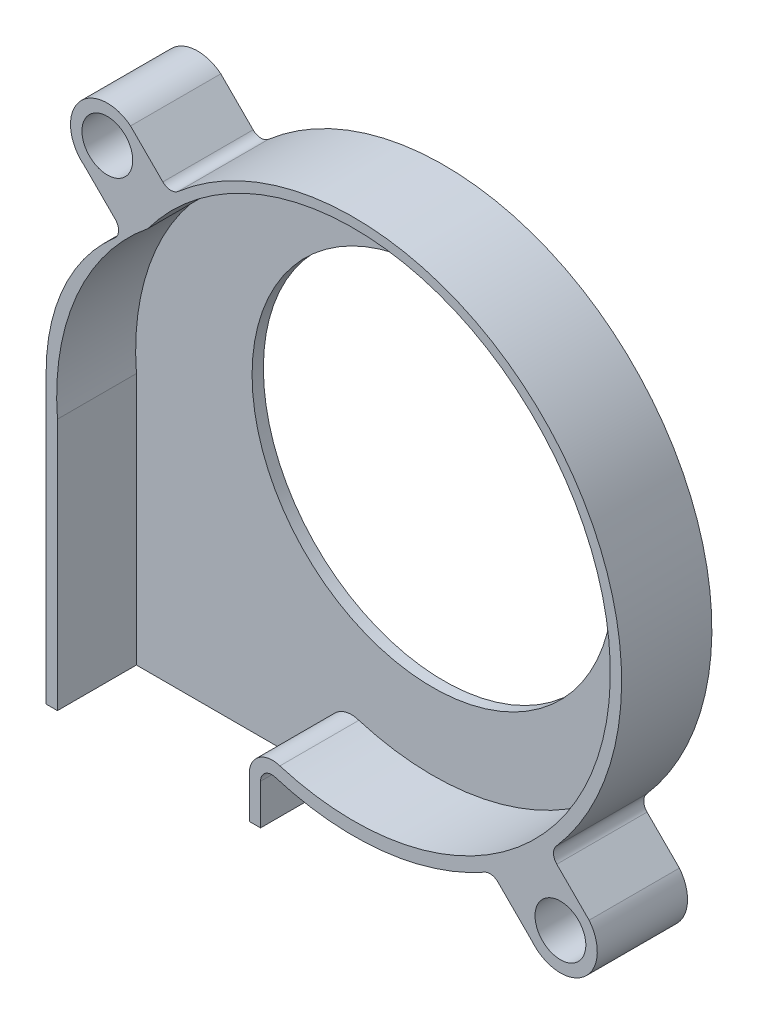
ISO-10303-21;
HEADER;
FILE_DESCRIPTION(('STEP AP214'),'2;1');
FILE_NAME('part.step','',(''),(''),'','','');
FILE_SCHEMA(('AUTOMOTIVE_DESIGN { 1 0 10303 214 1 1 1 1 }'));
ENDSEC;
DATA;
#1=APPLICATION_CONTEXT('core data for automotive mechanical design processes');
#2=APPLICATION_PROTOCOL_DEFINITION('international standard','automotive_design',2000,#1);
#3=PRODUCT_CONTEXT('',#1,'mechanical');
#4=PRODUCT('Part','Part','',(#3));
#5=PRODUCT_RELATED_PRODUCT_CATEGORY('part','',(#4));
#6=PRODUCT_DEFINITION_FORMATION('','',#4);
#7=PRODUCT_DEFINITION_CONTEXT('part definition',#1,'design');
#8=PRODUCT_DEFINITION('design','',#6,#7);
#9=PRODUCT_DEFINITION_SHAPE('','',#8);
#10=(LENGTH_UNIT() NAMED_UNIT(*) SI_UNIT(.MILLI.,.METRE.));
#11=(NAMED_UNIT(*) PLANE_ANGLE_UNIT() SI_UNIT($,.RADIAN.));
#12=(NAMED_UNIT(*) SI_UNIT($,.STERADIAN.) SOLID_ANGLE_UNIT());
#13=UNCERTAINTY_MEASURE_WITH_UNIT(LENGTH_MEASURE(1.E-05),#10,'distance_accuracy_value','');
#14=(GEOMETRIC_REPRESENTATION_CONTEXT(3) GLOBAL_UNCERTAINTY_ASSIGNED_CONTEXT((#13)) GLOBAL_UNIT_ASSIGNED_CONTEXT((#10,
#11,#12)) REPRESENTATION_CONTEXT('',''));
#15=CARTESIAN_POINT('',(0.,0.,0.));
#16=DIRECTION('',(0.,0.,1.));
#17=DIRECTION('',(1.,0.,0.));
#18=AXIS2_PLACEMENT_3D('',#15,#16,#17);
#19=CARTESIAN_POINT('',(5.41805094379559,39.5715414161188,8.));
#20=DIRECTION('',(0.,0.,-1.));
#21=DIRECTION('',(-1.,0.,0.));
#22=AXIS2_PLACEMENT_3D('',#19,#20,#21);
#23=CYLINDRICAL_SURFACE('',#22,1.);
#24=DIRECTION('',(0.,0.,-1.));
#25=VECTOR('',#24,1.);
#26=CARTESIAN_POINT('',(6.07364093376227,38.816424362242,8.));
#27=LINE('',#26,#25);
#28=CARTESIAN_POINT('',(6.07364093376226,38.816424362242,8.));
#29=VERTEX_POINT('',#28);
#30=CARTESIAN_POINT('',(6.07364093376226,38.816424362242,0.));
#31=VERTEX_POINT('',#30);
#32=EDGE_CURVE('E321',#29,#31,#27,.T.);
#33=ORIENTED_EDGE('',*,*,#32,.F.);
#34=CARTESIAN_POINT('',(5.41805094379559,39.5715414161188,8.));
#35=DIRECTION('',(0.,0.,-1.));
#36=DIRECTION('',(-1.,0.,0.));
#37=AXIS2_PLACEMENT_3D('',#34,#35,#36);
#38=CIRCLE('',#37,1.);
#39=CARTESIAN_POINT('',(6.12515772498214,40.2786481973053,8.));
#40=VERTEX_POINT('',#39);
#41=EDGE_CURVE('E327',#29,#40,#38,.F.);
#42=ORIENTED_EDGE('',*,*,#41,.T.);
#43=DIRECTION('',(0.,0.,1.));
#44=VECTOR('',#43,1.);
#45=CARTESIAN_POINT('',(6.12515772498214,40.2786481973053,8.));
#46=LINE('',#45,#44);
#47=CARTESIAN_POINT('',(6.12515772498214,40.2786481973053,0.));
#48=VERTEX_POINT('',#47);
#49=EDGE_CURVE('E324',#48,#40,#46,.T.);
#50=ORIENTED_EDGE('',*,*,#49,.F.);
#51=CARTESIAN_POINT('',(5.41805094379559,39.5715414161188,0.));
#52=DIRECTION('',(0.,0.,-1.));
#53=DIRECTION('',(-1.,0.,0.));
#54=AXIS2_PLACEMENT_3D('',#51,#52,#53);
#55=CIRCLE('',#54,1.);
#56=EDGE_CURVE('E329',#48,#31,#55,.T.);
#57=ORIENTED_EDGE('',*,*,#56,.T.);
#58=EDGE_LOOP('',(#33,#42,#50,#57));
#59=FACE_BOUND('',#58,.T.);
#60=ADVANCED_FACE('F33',(#59),#23,.F.);
#61=CARTESIAN_POINT('',(0.,0.,8.));
#62=DIRECTION('',(1.,0.,0.));
#63=DIRECTION('',(0.,0.,-1.));
#64=AXIS2_PLACEMENT_3D('',#61,#62,#63);
#65=PLANE('',#64);
#66=DIRECTION('',(0.,-1.,0.));
#67=VECTOR('',#66,1.);
#68=CARTESIAN_POINT('',(0.,0.,0.));
#69=LINE('',#68,#67);
#70=CARTESIAN_POINT('',(0.,25.5,0.));
#71=VERTEX_POINT('',#70);
#72=CARTESIAN_POINT('',(0.,0.,0.));
#73=VERTEX_POINT('',#72);
#74=EDGE_CURVE('E234',#71,#73,#69,.T.);
#75=ORIENTED_EDGE('',*,*,#74,.T.);
#76=DIRECTION('',(0.,0.,-1.));
#77=VECTOR('',#76,1.);
#78=CARTESIAN_POINT('',(0.,0.,8.));
#79=LINE('',#78,#77);
#80=CARTESIAN_POINT('',(0.,0.,8.));
#81=VERTEX_POINT('',#80);
#82=EDGE_CURVE('E318',#81,#73,#79,.T.);
#83=ORIENTED_EDGE('',*,*,#82,.F.);
#84=DIRECTION('',(0.,-1.,0.));
#85=VECTOR('',#84,1.);
#86=CARTESIAN_POINT('',(0.,0.,8.));
#87=LINE('',#86,#85);
#88=CARTESIAN_POINT('',(0.,25.5,8.));
#89=VERTEX_POINT('',#88);
#90=EDGE_CURVE('E243',#89,#81,#87,.T.);
#91=ORIENTED_EDGE('',*,*,#90,.F.);
#92=DIRECTION('',(0.,0.,-1.));
#93=VECTOR('',#92,1.);
#94=CARTESIAN_POINT('',(0.,25.5,8.));
#95=LINE('',#94,#93);
#96=EDGE_CURVE('E274',#89,#71,#95,.T.);
#97=ORIENTED_EDGE('',*,*,#96,.T.);
#98=EDGE_LOOP('',(#75,#83,#91,#97));
#99=FACE_BOUND('',#98,.T.);
#100=ADVANCED_FACE('F435',(#99),#65,.F.);
#101=CARTESIAN_POINT('',(0.,0.,8.));
#102=DIRECTION('',(0.,1.,0.));
#103=DIRECTION('',(0.,0.,1.));
#104=AXIS2_PLACEMENT_3D('',#101,#102,#103);
#105=PLANE('',#104);
#106=DIRECTION('',(1.,0.,0.));
#107=VECTOR('',#106,1.);
#108=CARTESIAN_POINT('',(0.,0.,8.));
#109=LINE('',#108,#107);
#110=CARTESIAN_POINT('',(18.,0.,8.));
#111=VERTEX_POINT('',#110);
#112=CARTESIAN_POINT('',(19.,0.,8.));
#113=VERTEX_POINT('',#112);
#114=EDGE_CURVE('E246',#111,#113,#109,.T.);
#115=ORIENTED_EDGE('',*,*,#114,.F.);
#116=DIRECTION('',(0.,0.,1.));
#117=VECTOR('',#116,1.);
#118=CARTESIAN_POINT('',(18.,0.,1.));
#119=LINE('',#118,#117);
#120=CARTESIAN_POINT('',(18.,0.,1.));
#121=VERTEX_POINT('',#120);
#122=EDGE_CURVE('E235',#121,#111,#119,.T.);
#123=ORIENTED_EDGE('',*,*,#122,.F.);
#124=DIRECTION('',(1.,0.,0.));
#125=VECTOR('',#124,1.);
#126=CARTESIAN_POINT('',(18.,0.,1.));
#127=LINE('',#126,#125);
#128=CARTESIAN_POINT('',(1.,0.,1.));
#129=VERTEX_POINT('',#128);
#130=EDGE_CURVE('E222',#129,#121,#127,.T.);
#131=ORIENTED_EDGE('',*,*,#130,.F.);
#132=DIRECTION('',(0.,0.,1.));
#133=VECTOR('',#132,1.);
#134=CARTESIAN_POINT('',(1.,0.,1.));
#135=LINE('',#134,#133);
#136=CARTESIAN_POINT('',(1.,0.,8.));
#137=VERTEX_POINT('',#136);
#138=EDGE_CURVE('E237',#129,#137,#135,.T.);
#139=ORIENTED_EDGE('',*,*,#138,.T.);
#140=EDGE_CURVE('E248',#81,#137,#109,.T.);
#141=ORIENTED_EDGE('',*,*,#140,.F.);
#142=ORIENTED_EDGE('',*,*,#82,.T.);
#143=DIRECTION('',(1.,0.,0.));
#144=VECTOR('',#143,1.);
#145=CARTESIAN_POINT('',(0.,0.,0.));
#146=LINE('',#145,#144);
#147=CARTESIAN_POINT('',(19.,0.,0.));
#148=VERTEX_POINT('',#147);
#149=EDGE_CURVE('E277',#73,#148,#146,.T.);
#150=ORIENTED_EDGE('',*,*,#149,.T.);
#151=DIRECTION('',(0.,0.,-1.));
#152=VECTOR('',#151,1.);
#153=CARTESIAN_POINT('',(19.,0.,8.));
#154=LINE('',#153,#152);
#155=EDGE_CURVE('E315',#113,#148,#154,.T.);
#156=ORIENTED_EDGE('',*,*,#155,.F.);
#157=EDGE_LOOP('',(#115,#123,#131,#139,#141,#142,#150,#156));
#158=FACE_BOUND('',#157,.T.);
#159=ADVANCED_FACE('F438',(#158),#105,.F.);
#160=CARTESIAN_POINT('',(19.,0.,8.));
#161=DIRECTION('',(-1.,0.,0.));
#162=DIRECTION('',(0.,0.,1.));
#163=AXIS2_PLACEMENT_3D('',#160,#161,#162);
#164=PLANE('',#163);
#165=DIRECTION('',(0.,1.,0.));
#166=VECTOR('',#165,1.);
#167=CARTESIAN_POINT('',(19.,0.,0.));
#168=LINE('',#167,#166);
#169=CARTESIAN_POINT('',(19.,3.58568086760154,0.));
#170=VERTEX_POINT('',#169);
#171=EDGE_CURVE('E279',#148,#170,#168,.T.);
#172=ORIENTED_EDGE('',*,*,#171,.T.);
#173=DIRECTION('',(0.,0.,1.));
#174=VECTOR('',#173,1.);
#175=CARTESIAN_POINT('',(19.,3.58568086760154,8.));
#176=LINE('',#175,#174);
#177=CARTESIAN_POINT('',(19.,3.58568086760154,8.));
#178=VERTEX_POINT('',#177);
#179=EDGE_CURVE('E56',#170,#178,#176,.T.);
#180=ORIENTED_EDGE('',*,*,#179,.T.);
#181=DIRECTION('',(0.,1.,0.));
#182=VECTOR('',#181,1.);
#183=CARTESIAN_POINT('',(19.,0.,8.));
#184=LINE('',#183,#182);
#185=EDGE_CURVE('E251',#113,#178,#184,.T.);
#186=ORIENTED_EDGE('',*,*,#185,.F.);
#187=ORIENTED_EDGE('',*,*,#155,.T.);
#188=EDGE_LOOP('',(#172,#180,#186,#187));
#189=FACE_BOUND('',#188,.T.);
#190=ADVANCED_FACE('F370',(#189),#164,.F.);
#191=CARTESIAN_POINT('',(27.25,27.25,8.));
#192=DIRECTION('',(0.,0.,-1.));
#193=DIRECTION('',(-1.,0.,0.));
#194=AXIS2_PLACEMENT_3D('',#191,#192,#193);
#195=CYLINDRICAL_SURFACE('',#194,23.75);
#196=CARTESIAN_POINT('',(27.25,27.25,8.));
#197=DIRECTION('',(0.,0.,1.));
#198=DIRECTION('',(-1.,0.,0.));
#199=AXIS2_PLACEMENT_3D('',#196,#197,#198);
#200=CIRCLE('',#199,23.75);
#201=CARTESIAN_POINT('',(20.2929292929293,4.54181497396108,8.));
#202=VERTEX_POINT('',#201);
#203=CARTESIAN_POINT('',(38.8489057741253,6.52494548033799,8.));
#204=VERTEX_POINT('',#203);
#205=EDGE_CURVE('E253',#202,#204,#200,.T.);
#206=ORIENTED_EDGE('',*,*,#205,.F.);
#207=DIRECTION('',(0.,0.,-1.));
#208=VECTOR('',#207,1.);
#209=CARTESIAN_POINT('',(20.2929292929293,4.54181497396108,8.));
#210=LINE('',#209,#208);
#211=CARTESIAN_POINT('',(20.2929292929293,4.54181497396108,0.));
#212=VERTEX_POINT('',#211);
#213=EDGE_CURVE('E360',#202,#212,#210,.T.);
#214=ORIENTED_EDGE('',*,*,#213,.T.);
#215=CARTESIAN_POINT('',(27.25,27.25,0.));
#216=DIRECTION('',(0.,0.,1.));
#217=DIRECTION('',(-1.,0.,0.));
#218=AXIS2_PLACEMENT_3D('',#215,#216,#217);
#219=CIRCLE('',#218,23.75);
#220=CARTESIAN_POINT('',(38.8489057741253,6.52494548033799,0.));
#221=VERTEX_POINT('',#220);
#222=EDGE_CURVE('E281',#212,#221,#219,.T.);
#223=ORIENTED_EDGE('',*,*,#222,.T.);
#224=DIRECTION('',(0.,0.,-1.));
#225=VECTOR('',#224,1.);
#226=CARTESIAN_POINT('',(38.8489057741253,6.52494548033799,8.));
#227=LINE('',#226,#225);
#228=EDGE_CURVE('E334',#221,#204,#227,.F.);
#229=ORIENTED_EDGE('',*,*,#228,.T.);
#230=EDGE_LOOP('',(#206,#214,#223,#229));
#231=FACE_BOUND('',#230,.T.);
#232=ADVANCED_FACE('F377',(#231),#195,.T.);
#233=CARTESIAN_POINT('',(39.5004967766851,6.90330914560237,8.));
#234=DIRECTION('',(0.707106781186547,0.707106781186548,0.));
#235=DIRECTION('',(-0.707106781186548,0.707106781186547,0.));
#236=AXIS2_PLACEMENT_3D('',#233,#234,#235);
#237=PLANE('',#236);
#238=DIRECTION('',(0.707106781186548,-0.707106781186547,0.));
#239=VECTOR('',#238,1.);
#240=CARTESIAN_POINT('',(39.5004967766851,6.90330914560237,8.));
#241=LINE('',#240,#239);
#242=CARTESIAN_POINT('',(40.044387535275,6.35941838701245,8.));
#243=VERTEX_POINT('',#242);
#244=CARTESIAN_POINT('',(43.0360306826177,3.36777523966974,8.));
#245=VERTEX_POINT('',#244);
#246=EDGE_CURVE('E255',#243,#245,#241,.T.);
#247=ORIENTED_EDGE('',*,*,#246,.F.);
#248=DIRECTION('',(0.,0.,1.));
#249=VECTOR('',#248,1.);
#250=CARTESIAN_POINT('',(40.044387535275,6.35941838701245,0.));
#251=LINE('',#250,#249);
#252=CARTESIAN_POINT('',(40.044387535275,6.35941838701245,0.));
#253=VERTEX_POINT('',#252);
#254=EDGE_CURVE('E331',#243,#253,#251,.F.);
#255=ORIENTED_EDGE('',*,*,#254,.T.);
#256=DIRECTION('',(0.707106781186548,-0.707106781186547,0.));
#257=VECTOR('',#256,1.);
#258=CARTESIAN_POINT('',(39.5004967766851,6.90330914560237,0.));
#259=LINE('',#258,#257);
#260=CARTESIAN_POINT('',(43.0360306826177,3.36777523966974,0.));
#261=VERTEX_POINT('',#260);
#262=EDGE_CURVE('E283',#253,#261,#259,.T.);
#263=ORIENTED_EDGE('',*,*,#262,.T.);
#264=DIRECTION('',(0.,0.,-1.));
#265=VECTOR('',#264,1.);
#266=CARTESIAN_POINT('',(43.0360306826177,3.36777523966974,8.));
#267=LINE('',#266,#265);
#268=EDGE_CURVE('E312',#245,#261,#267,.T.);
#269=ORIENTED_EDGE('',*,*,#268,.F.);
#270=EDGE_LOOP('',(#247,#255,#263,#269));
#271=FACE_BOUND('',#270,.T.);
#272=ADVANCED_FACE('F386',(#271),#237,.F.);
#273=CARTESIAN_POINT('',(45.5772506023579,5.42274939764212,8.));
#274=DIRECTION('',(0.,0.,-1.));
#275=DIRECTION('',(-1.,0.,0.));
#276=AXIS2_PLACEMENT_3D('',#273,#274,#275);
#277=CYLINDRICAL_SURFACE('',#276,3.26813669702149);
#278=CARTESIAN_POINT('',(45.5772506023579,5.42274939764212,0.));
#279=DIRECTION('',(0.,0.,1.));
#280=DIRECTION('',(-1.,0.,0.));
#281=AXIS2_PLACEMENT_3D('',#278,#279,#280);
#282=CIRCLE('',#281,3.26813669702149);
#283=CARTESIAN_POINT('',(48.118470522098,7.47772355561462,0.));
#284=VERTEX_POINT('',#283);
#285=EDGE_CURVE('E285',#261,#284,#282,.T.);
#286=ORIENTED_EDGE('',*,*,#285,.T.);
#287=DIRECTION('',(0.,0.,-1.));
#288=VECTOR('',#287,1.);
#289=CARTESIAN_POINT('',(48.118470522098,7.47772355561462,8.));
#290=LINE('',#289,#288);
#291=CARTESIAN_POINT('',(48.118470522098,7.47772355561462,8.));
#292=VERTEX_POINT('',#291);
#293=EDGE_CURVE('E309',#292,#284,#290,.T.);
#294=ORIENTED_EDGE('',*,*,#293,.F.);
#295=CARTESIAN_POINT('',(45.5772506023579,5.42274939764212,8.));
#296=DIRECTION('',(0.,0.,1.));
#297=DIRECTION('',(-1.,0.,0.));
#298=AXIS2_PLACEMENT_3D('',#295,#296,#297);
#299=CIRCLE('',#298,3.26813669702149);
#300=EDGE_CURVE('E257',#245,#292,#299,.T.);
#301=ORIENTED_EDGE('',*,*,#300,.F.);
#302=ORIENTED_EDGE('',*,*,#268,.T.);
#303=EDGE_LOOP('',(#286,#294,#301,#302));
#304=FACE_BOUND('',#303,.T.);
#305=ADVANCED_FACE('F392',(#304),#277,.T.);
#306=CARTESIAN_POINT('',(44.5829366161652,11.0132574615473,8.));
#307=DIRECTION('',(-0.707106781186547,-0.707106781186547,0.));
#308=DIRECTION('',(0.707106781186548,-0.707106781186548,0.));
#309=AXIS2_PLACEMENT_3D('',#306,#307,#308);
#310=PLANE('',#309);
#311=DIRECTION('',(-0.707106781186547,0.707106781186547,0.));
#312=VECTOR('',#311,1.);
#313=CARTESIAN_POINT('',(44.5829366161652,11.0132574615473,0.));
#314=LINE('',#313,#312);
#315=CARTESIAN_POINT('',(45.2539188003819,10.3422752773307,0.));
#316=VERTEX_POINT('',#315);
#317=EDGE_CURVE('E287',#284,#316,#314,.T.);
#318=ORIENTED_EDGE('',*,*,#317,.T.);
#319=DIRECTION('',(0.,0.,1.));
#320=VECTOR('',#319,1.);
#321=CARTESIAN_POINT('',(45.2539188003819,10.3422752773307,8.));
#322=LINE('',#321,#320);
#323=CARTESIAN_POINT('',(45.2539188003819,10.3422752773307,8.));
#324=VERTEX_POINT('',#323);
#325=EDGE_CURVE('E342',#316,#324,#322,.T.);
#326=ORIENTED_EDGE('',*,*,#325,.T.);
#327=DIRECTION('',(-0.707106781186547,0.707106781186547,0.));
#328=VECTOR('',#327,1.);
#329=CARTESIAN_POINT('',(44.5829366161652,11.0132574615473,8.));
#330=LINE('',#329,#328);
#331=EDGE_CURVE('E259',#292,#324,#330,.T.);
#332=ORIENTED_EDGE('',*,*,#331,.F.);
#333=ORIENTED_EDGE('',*,*,#293,.T.);
#334=EDGE_LOOP('',(#318,#326,#332,#333));
#335=FACE_BOUND('',#334,.T.);
#336=ADVANCED_FACE('F644',(#335),#310,.F.);
#337=CARTESIAN_POINT('',(27.25,27.25,8.));
#338=DIRECTION('',(0.,0.,-1.));
#339=DIRECTION('',(-1.,0.,0.));
#340=AXIS2_PLACEMENT_3D('',#337,#338,#339);
#341=CYLINDRICAL_SURFACE('',#340,23.75);
#342=CARTESIAN_POINT('',(27.25,27.25,8.));
#343=DIRECTION('',(0.,0.,1.));
#344=DIRECTION('',(-1.,0.,0.));
#345=AXIS2_PLACEMENT_3D('',#342,#343,#344);
#346=CIRCLE('',#345,23.75);
#347=CARTESIAN_POINT('',(45.2050245479697,11.7039524803954,8.));
#348=VERTEX_POINT('',#347);
#349=CARTESIAN_POINT('',(11.7039524803953,45.2050245479697,8.));
#350=VERTEX_POINT('',#349);
#351=EDGE_CURVE('E262',#348,#350,#346,.T.);
#352=ORIENTED_EDGE('',*,*,#351,.F.);
#353=DIRECTION('',(0.,0.,-1.));
#354=VECTOR('',#353,1.);
#355=CARTESIAN_POINT('',(45.2050245479697,11.7039524803954,8.));
#356=LINE('',#355,#354);
#357=CARTESIAN_POINT('',(45.2050245479697,11.7039524803954,0.));
#358=VERTEX_POINT('',#357);
#359=EDGE_CURVE('E339',#348,#358,#356,.T.);
#360=ORIENTED_EDGE('',*,*,#359,.T.);
#361=CARTESIAN_POINT('',(27.25,27.25,0.));
#362=DIRECTION('',(0.,0.,1.));
#363=DIRECTION('',(-1.,0.,0.));
#364=AXIS2_PLACEMENT_3D('',#361,#362,#363);
#365=CIRCLE('',#364,23.75);
#366=CARTESIAN_POINT('',(11.7039524803953,45.2050245479697,0.));
#367=VERTEX_POINT('',#366);
#368=EDGE_CURVE('E290',#358,#367,#365,.T.);
#369=ORIENTED_EDGE('',*,*,#368,.T.);
#370=DIRECTION('',(0.,0.,-1.));
#371=VECTOR('',#370,1.);
#372=CARTESIAN_POINT('',(11.7039524803953,45.2050245479697,8.));
#373=LINE('',#372,#371);
#374=EDGE_CURVE('E337',#367,#350,#373,.F.);
#375=ORIENTED_EDGE('',*,*,#374,.T.);
#376=EDGE_LOOP('',(#352,#360,#369,#375));
#377=FACE_BOUND('',#376,.T.);
#378=ADVANCED_FACE('F403',(#377),#341,.T.);
#379=CARTESIAN_POINT('',(11.0132574615473,44.5829366161652,8.));
#380=DIRECTION('',(-0.707106781186547,-0.707106781186547,0.));
#381=DIRECTION('',(0.707106781186548,-0.707106781186548,0.));
#382=AXIS2_PLACEMENT_3D('',#379,#380,#381);
#383=PLANE('',#382);
#384=DIRECTION('',(-0.707106781186547,0.707106781186547,0.));
#385=VECTOR('',#384,1.);
#386=CARTESIAN_POINT('',(11.0132574615473,44.5829366161652,8.));
#387=LINE('',#386,#385);
#388=CARTESIAN_POINT('',(10.3422752773307,45.2539188003819,8.));
#389=VERTEX_POINT('',#388);
#390=CARTESIAN_POINT('',(7.4777235556146,48.118470522098,8.));
#391=VERTEX_POINT('',#390);
#392=EDGE_CURVE('E265',#389,#391,#387,.T.);
#393=ORIENTED_EDGE('',*,*,#392,.F.);
#394=DIRECTION('',(0.,0.,1.));
#395=VECTOR('',#394,1.);
#396=CARTESIAN_POINT('',(10.3422752773307,45.2539188003819,0.));
#397=LINE('',#396,#395);
#398=CARTESIAN_POINT('',(10.3422752773307,45.2539188003819,0.));
#399=VERTEX_POINT('',#398);
#400=EDGE_CURVE('E344',#389,#399,#397,.F.);
#401=ORIENTED_EDGE('',*,*,#400,.T.);
#402=DIRECTION('',(-0.707106781186547,0.707106781186547,0.));
#403=VECTOR('',#402,1.);
#404=CARTESIAN_POINT('',(11.0132574615473,44.5829366161652,0.));
#405=LINE('',#404,#403);
#406=CARTESIAN_POINT('',(7.4777235556146,48.118470522098,0.));
#407=VERTEX_POINT('',#406);
#408=EDGE_CURVE('E293',#399,#407,#405,.T.);
#409=ORIENTED_EDGE('',*,*,#408,.T.);
#410=DIRECTION('',(0.,0.,-1.));
#411=VECTOR('',#410,1.);
#412=CARTESIAN_POINT('',(7.4777235556146,48.118470522098,8.));
#413=LINE('',#412,#411);
#414=EDGE_CURVE('E306',#391,#407,#413,.T.);
#415=ORIENTED_EDGE('',*,*,#414,.F.);
#416=EDGE_LOOP('',(#393,#401,#409,#415));
#417=FACE_BOUND('',#416,.T.);
#418=ADVANCED_FACE('F414',(#417),#383,.F.);
#419=CARTESIAN_POINT('',(5.42274939764211,45.5772506023579,8.));
#420=DIRECTION('',(0.,0.,-1.));
#421=DIRECTION('',(-1.,0.,0.));
#422=AXIS2_PLACEMENT_3D('',#419,#420,#421);
#423=CYLINDRICAL_SURFACE('',#422,3.26813669702149);
#424=CARTESIAN_POINT('',(5.42274939764211,45.5772506023579,0.));
#425=DIRECTION('',(0.,0.,1.));
#426=DIRECTION('',(1.,0.,0.));
#427=AXIS2_PLACEMENT_3D('',#424,#425,#426);
#428=CIRCLE('',#427,3.26813669702149);
#429=CARTESIAN_POINT('',(3.36777523966978,43.0360306826177,0.));
#430=VERTEX_POINT('',#429);
#431=EDGE_CURVE('E295',#407,#430,#428,.T.);
#432=ORIENTED_EDGE('',*,*,#431,.T.);
#433=DIRECTION('',(0.,0.,-1.));
#434=VECTOR('',#433,1.);
#435=CARTESIAN_POINT('',(3.36777523966978,43.0360306826177,8.));
#436=LINE('',#435,#434);
#437=CARTESIAN_POINT('',(3.36777523966978,43.0360306826177,8.));
#438=VERTEX_POINT('',#437);
#439=EDGE_CURVE('E303',#438,#430,#436,.T.);
#440=ORIENTED_EDGE('',*,*,#439,.F.);
#441=CARTESIAN_POINT('',(5.42274939764211,45.5772506023579,8.));
#442=DIRECTION('',(0.,0.,1.));
#443=DIRECTION('',(1.,0.,0.));
#444=AXIS2_PLACEMENT_3D('',#441,#442,#443);
#445=CIRCLE('',#444,3.26813669702149);
#446=EDGE_CURVE('E267',#391,#438,#445,.T.);
#447=ORIENTED_EDGE('',*,*,#446,.F.);
#448=ORIENTED_EDGE('',*,*,#414,.T.);
#449=EDGE_LOOP('',(#432,#440,#447,#448));
#450=FACE_BOUND('',#449,.T.);
#451=ADVANCED_FACE('F420',(#450),#423,.T.);
#452=CARTESIAN_POINT('',(6.90330914560238,39.5004967766851,8.));
#453=DIRECTION('',(0.707106781186547,0.707106781186548,0.));
#454=DIRECTION('',(-0.707106781186548,0.707106781186547,0.));
#455=AXIS2_PLACEMENT_3D('',#452,#453,#454);
#456=PLANE('',#455);
#457=DIRECTION('',(0.707106781186548,-0.707106781186547,0.));
#458=VECTOR('',#457,1.);
#459=CARTESIAN_POINT('',(6.90330914560238,39.5004967766851,0.));
#460=LINE('',#459,#458);
#461=EDGE_CURVE('E297',#430,#48,#460,.T.);
#462=ORIENTED_EDGE('',*,*,#461,.T.);
#463=ORIENTED_EDGE('',*,*,#49,.T.);
#464=DIRECTION('',(0.707106781186548,-0.707106781186547,0.));
#465=VECTOR('',#464,1.);
#466=CARTESIAN_POINT('',(6.90330914560238,39.5004967766851,8.));
#467=LINE('',#466,#465);
#468=EDGE_CURVE('E269',#438,#40,#467,.T.);
#469=ORIENTED_EDGE('',*,*,#468,.F.);
#470=ORIENTED_EDGE('',*,*,#439,.T.);
#471=EDGE_LOOP('',(#462,#463,#469,#470));
#472=FACE_BOUND('',#471,.T.);
#473=ADVANCED_FACE('F423',(#472),#456,.F.);
#474=CARTESIAN_POINT('',(17.6349140757397,25.5,8.));
#475=DIRECTION('',(0.,0.,-1.));
#476=DIRECTION('',(-1.,0.,0.));
#477=AXIS2_PLACEMENT_3D('',#474,#475,#476);
#478=CYLINDRICAL_SURFACE('',#477,17.6349140757397);
#479=CARTESIAN_POINT('',(17.6349140757397,25.5,8.));
#480=DIRECTION('',(0.,0.,1.));
#481=DIRECTION('',(-1.,0.,0.));
#482=AXIS2_PLACEMENT_3D('',#479,#480,#481);
#483=CIRCLE('',#482,17.6349140757397);
#484=EDGE_CURVE('E272',#29,#89,#483,.T.);
#485=ORIENTED_EDGE('',*,*,#484,.F.);
#486=ORIENTED_EDGE('',*,*,#32,.T.);
#487=CARTESIAN_POINT('',(17.6349140757397,25.5,0.));
#488=DIRECTION('',(0.,0.,1.));
#489=DIRECTION('',(-1.,0.,0.));
#490=AXIS2_PLACEMENT_3D('',#487,#488,#489);
#491=CIRCLE('',#490,17.6349140757397);
#492=EDGE_CURVE('E247',#31,#71,#491,.T.);
#493=ORIENTED_EDGE('',*,*,#492,.T.);
#494=ORIENTED_EDGE('',*,*,#96,.F.);
#495=EDGE_LOOP('',(#485,#486,#493,#494));
#496=FACE_BOUND('',#495,.T.);
#497=ADVANCED_FACE('F432',(#496),#478,.T.);
#498=CARTESIAN_POINT('',(17.6349140757397,25.5,8.));
#499=DIRECTION('',(0.,0.,-1.));
#500=DIRECTION('',(-1.,0.,0.));
#501=AXIS2_PLACEMENT_3D('',#498,#499,#500);
#502=PLANE('',#501);
#503=CARTESIAN_POINT('',(45.5772506023579,5.42274939764213,8.));
#504=DIRECTION('',(0.,0.,-1.));
#505=DIRECTION('',(-1.,0.,0.));
#506=AXIS2_PLACEMENT_3D('',#503,#504,#505);
#507=CIRCLE('',#506,2.25);
#508=CARTESIAN_POINT('',(43.3272506023579,5.42274939764213,8.));
#509=VERTEX_POINT('',#508);
#510=EDGE_CURVE('E578',#509,#509,#507,.T.);
#511=ORIENTED_EDGE('',*,*,#510,.T.);
#512=EDGE_LOOP('',(#511));
#513=FACE_BOUND('',#512,.T.);
#514=CARTESIAN_POINT('',(5.42274939764212,45.5772506023579,8.));
#515=DIRECTION('',(0.,0.,-1.));
#516=DIRECTION('',(-1.,0.,0.));
#517=AXIS2_PLACEMENT_3D('',#514,#515,#516);
#518=CIRCLE('',#517,2.25);
#519=CARTESIAN_POINT('',(3.17274939764212,45.5772506023579,8.));
#520=VERTEX_POINT('',#519);
#521=EDGE_CURVE('E588',#520,#520,#518,.T.);
#522=ORIENTED_EDGE('',*,*,#521,.T.);
#523=EDGE_LOOP('',(#522));
#524=FACE_BOUND('',#523,.T.);
#525=CARTESIAN_POINT('',(20.0531728672514,3.6680596155582,8.));
#526=DIRECTION('',(0.,0.,-1.));
#527=DIRECTION('',(-1.,0.,0.));
#528=AXIS2_PLACEMENT_3D('',#525,#526,#527);
#529=CIRCLE('',#528,2.05676617192079);
#530=CARTESIAN_POINT('',(18.,3.54653487264297,8.));
#531=VERTEX_POINT('',#530);
#532=CARTESIAN_POINT('',(20.7133174398193,5.61600628558456,8.));
#533=VERTEX_POINT('',#532);
#534=EDGE_CURVE('E48',#531,#533,#529,.T.);
#535=ORIENTED_EDGE('',*,*,#534,.F.);
#536=DIRECTION('',(0.,1.,0.));
#537=VECTOR('',#536,1.);
#538=CARTESIAN_POINT('',(18.,0.,8.));
#539=LINE('',#538,#537);
#540=EDGE_CURVE('E209',#111,#531,#539,.T.);
#541=ORIENTED_EDGE('',*,*,#540,.F.);
#542=ORIENTED_EDGE('',*,*,#114,.T.);
#543=ORIENTED_EDGE('',*,*,#185,.T.);
#544=CARTESIAN_POINT('',(20.,3.58568086760154,8.));
#545=DIRECTION('',(0.,0.,-1.));
#546=DIRECTION('',(-1.,0.,0.));
#547=AXIS2_PLACEMENT_3D('',#544,#545,#546);
#548=CIRCLE('',#547,1.);
#549=EDGE_CURVE('E11',#178,#202,#548,.T.);
#550=ORIENTED_EDGE('',*,*,#549,.T.);
#551=ORIENTED_EDGE('',*,*,#205,.T.);
#552=CARTESIAN_POINT('',(39.3372807540885,5.6523116058259,8.));
#553=DIRECTION('',(0.,0.,-1.));
#554=DIRECTION('',(-1.,0.,0.));
#555=AXIS2_PLACEMENT_3D('',#552,#553,#554);
#556=CIRCLE('',#555,1.);
#557=EDGE_CURVE('E350',#204,#243,#556,.T.);
#558=ORIENTED_EDGE('',*,*,#557,.T.);
#559=ORIENTED_EDGE('',*,*,#246,.T.);
#560=ORIENTED_EDGE('',*,*,#300,.T.);
#561=ORIENTED_EDGE('',*,*,#331,.T.);
#562=CARTESIAN_POINT('',(45.9610255815684,11.0493820585173,8.));
#563=DIRECTION('',(0.,0.,-1.));
#564=DIRECTION('',(-1.,0.,0.));
#565=AXIS2_PLACEMENT_3D('',#562,#563,#564);
#566=CIRCLE('',#565,1.);
#567=EDGE_CURVE('E354',#324,#348,#566,.T.);
#568=ORIENTED_EDGE('',*,*,#567,.T.);
#569=ORIENTED_EDGE('',*,*,#351,.T.);
#570=CARTESIAN_POINT('',(11.0493820585173,45.9610255815684,8.));
#571=DIRECTION('',(0.,0.,-1.));
#572=DIRECTION('',(-1.,0.,0.));
#573=AXIS2_PLACEMENT_3D('',#570,#571,#572);
#574=CIRCLE('',#573,1.);
#575=EDGE_CURVE('E358',#350,#389,#574,.T.);
#576=ORIENTED_EDGE('',*,*,#575,.T.);
#577=ORIENTED_EDGE('',*,*,#392,.T.);
#578=ORIENTED_EDGE('',*,*,#446,.T.);
#579=ORIENTED_EDGE('',*,*,#468,.T.);
#580=ORIENTED_EDGE('',*,*,#41,.F.);
#581=ORIENTED_EDGE('',*,*,#484,.T.);
#582=ORIENTED_EDGE('',*,*,#90,.T.);
#583=ORIENTED_EDGE('',*,*,#140,.T.);
#584=DIRECTION('',(0.,-1.,0.));
#585=VECTOR('',#584,1.);
#586=CARTESIAN_POINT('',(1.,0.,8.));
#587=LINE('',#586,#585);
#588=CARTESIAN_POINT('',(0.999999999999997,22.3741954552597,8.));
#589=VERTEX_POINT('',#588);
#590=EDGE_CURVE('E212',#589,#137,#587,.T.);
#591=ORIENTED_EDGE('',*,*,#590,.F.);
#592=CARTESIAN_POINT('',(22.6397362153286,24.1051021933097,8.));
#593=DIRECTION('',(0.,0.,1.));
#594=DIRECTION('',(-1.,0.,0.));
#595=AXIS2_PLACEMENT_3D('',#592,#593,#594);
#596=CIRCLE('',#595,21.7088512272029);
#597=CARTESIAN_POINT('',(9.00771762073434,41.0001396493636,8.));
#598=VERTEX_POINT('',#597);
#599=EDGE_CURVE('E228',#598,#589,#596,.T.);
#600=ORIENTED_EDGE('',*,*,#599,.F.);
#601=CARTESIAN_POINT('',(27.25,27.4066988194952,8.));
#602=DIRECTION('',(0.,0.,1.));
#603=DIRECTION('',(-1.,0.,0.));
#604=AXIS2_PLACEMENT_3D('',#601,#602,#603);
#605=CIRCLE('',#604,22.75);
#606=EDGE_CURVE('E226',#533,#598,#605,.T.);
#607=ORIENTED_EDGE('',*,*,#606,.F.);
#608=EDGE_LOOP('',(#535,#541,#542,#543,#550,#551,#558,#559,#560,#561,#568,#569,#576,#577,#578,
#579,#580,#581,#582,#583,#591,#600,#607));
#609=FACE_BOUND('',#608,.T.);
#610=ADVANCED_FACE('F375',(#513,#524,#609),#502,.F.);
#611=CARTESIAN_POINT('',(17.6349140757397,25.5,0.));
#612=DIRECTION('',(0.,0.,-1.));
#613=DIRECTION('',(-1.,0.,0.));
#614=AXIS2_PLACEMENT_3D('',#611,#612,#613);
#615=PLANE('',#614);
#616=CARTESIAN_POINT('',(45.5772506023579,5.42274939764213,0.));
#617=DIRECTION('',(0.,0.,-1.));
#618=DIRECTION('',(-1.,0.,0.));
#619=AXIS2_PLACEMENT_3D('',#616,#617,#618);
#620=CIRCLE('',#619,2.25);
#621=CARTESIAN_POINT('',(43.3272506023579,5.42274939764213,0.));
#622=VERTEX_POINT('',#621);
#623=EDGE_CURVE('E581',#622,#622,#620,.T.);
#624=ORIENTED_EDGE('',*,*,#623,.F.);
#625=EDGE_LOOP('',(#624));
#626=FACE_BOUND('',#625,.T.);
#627=CARTESIAN_POINT('',(5.42274939764212,45.5772506023579,0.));
#628=DIRECTION('',(0.,0.,-1.));
#629=DIRECTION('',(-1.,0.,0.));
#630=AXIS2_PLACEMENT_3D('',#627,#628,#629);
#631=CIRCLE('',#630,2.25);
#632=CARTESIAN_POINT('',(3.17274939764212,45.5772506023579,0.));
#633=VERTEX_POINT('',#632);
#634=EDGE_CURVE('E583',#633,#633,#631,.T.);
#635=ORIENTED_EDGE('',*,*,#634,.F.);
#636=EDGE_LOOP('',(#635));
#637=FACE_BOUND('',#636,.T.);
#638=CARTESIAN_POINT('',(27.25,27.4066988194952,0.));
#639=DIRECTION('',(0.,0.,-1.));
#640=DIRECTION('',(-1.,0.,0.));
#641=AXIS2_PLACEMENT_3D('',#638,#639,#640);
#642=CIRCLE('',#641,16.);
#643=CARTESIAN_POINT('',(11.25,27.4066988194952,0.));
#644=VERTEX_POINT('',#643);
#645=EDGE_CURVE('E215',#644,#644,#642,.T.);
#646=ORIENTED_EDGE('',*,*,#645,.F.);
#647=EDGE_LOOP('',(#646));
#648=FACE_BOUND('',#647,.T.);
#649=ORIENTED_EDGE('',*,*,#74,.F.);
#650=ORIENTED_EDGE('',*,*,#492,.F.);
#651=ORIENTED_EDGE('',*,*,#56,.F.);
#652=ORIENTED_EDGE('',*,*,#461,.F.);
#653=ORIENTED_EDGE('',*,*,#431,.F.);
#654=ORIENTED_EDGE('',*,*,#408,.F.);
#655=CARTESIAN_POINT('',(11.0493820585173,45.9610255815684,0.));
#656=DIRECTION('',(0.,0.,-1.));
#657=DIRECTION('',(-1.,0.,0.));
#658=AXIS2_PLACEMENT_3D('',#655,#656,#657);
#659=CIRCLE('',#658,1.);
#660=EDGE_CURVE('E356',#399,#367,#659,.F.);
#661=ORIENTED_EDGE('',*,*,#660,.T.);
#662=ORIENTED_EDGE('',*,*,#368,.F.);
#663=CARTESIAN_POINT('',(45.9610255815684,11.0493820585173,0.));
#664=DIRECTION('',(0.,0.,-1.));
#665=DIRECTION('',(-1.,0.,0.));
#666=AXIS2_PLACEMENT_3D('',#663,#664,#665);
#667=CIRCLE('',#666,1.);
#668=EDGE_CURVE('E352',#358,#316,#667,.F.);
#669=ORIENTED_EDGE('',*,*,#668,.T.);
#670=ORIENTED_EDGE('',*,*,#317,.F.);
#671=ORIENTED_EDGE('',*,*,#285,.F.);
#672=ORIENTED_EDGE('',*,*,#262,.F.);
#673=CARTESIAN_POINT('',(39.3372807540885,5.6523116058259,0.));
#674=DIRECTION('',(0.,0.,-1.));
#675=DIRECTION('',(-1.,0.,0.));
#676=AXIS2_PLACEMENT_3D('',#673,#674,#675);
#677=CIRCLE('',#676,1.);
#678=EDGE_CURVE('E347',#253,#221,#677,.F.);
#679=ORIENTED_EDGE('',*,*,#678,.T.);
#680=ORIENTED_EDGE('',*,*,#222,.F.);
#681=CARTESIAN_POINT('',(20.,3.58568086760154,0.));
#682=DIRECTION('',(0.,0.,-1.));
#683=DIRECTION('',(-1.,0.,0.));
#684=AXIS2_PLACEMENT_3D('',#681,#682,#683);
#685=CIRCLE('',#684,1.);
#686=EDGE_CURVE('E41',#212,#170,#685,.F.);
#687=ORIENTED_EDGE('',*,*,#686,.T.);
#688=ORIENTED_EDGE('',*,*,#171,.F.);
#689=ORIENTED_EDGE('',*,*,#149,.F.);
#690=EDGE_LOOP('',(#649,#650,#651,#652,#653,#654,#661,#662,#669,#670,#671,#672,#679,#680,#687,
#688,#689));
#691=FACE_BOUND('',#690,.T.);
#692=ADVANCED_FACE('F367',(#626,#637,#648,#691),#615,.T.);
#693=CARTESIAN_POINT('',(39.3372807540885,5.6523116058259,8.));
#694=DIRECTION('',(0.,0.,-1.));
#695=DIRECTION('',(-1.,0.,0.));
#696=AXIS2_PLACEMENT_3D('',#693,#694,#695);
#697=CYLINDRICAL_SURFACE('',#696,1.);
#698=ORIENTED_EDGE('',*,*,#557,.F.);
#699=ORIENTED_EDGE('',*,*,#228,.F.);
#700=ORIENTED_EDGE('',*,*,#678,.F.);
#701=ORIENTED_EDGE('',*,*,#254,.F.);
#702=EDGE_LOOP('',(#698,#699,#700,#701));
#703=FACE_BOUND('',#702,.T.);
#704=ADVANCED_FACE('F382',(#703),#697,.F.);
#705=CARTESIAN_POINT('',(45.9610255815684,11.0493820585173,8.));
#706=DIRECTION('',(0.,0.,-1.));
#707=DIRECTION('',(-1.,0.,0.));
#708=AXIS2_PLACEMENT_3D('',#705,#706,#707);
#709=CYLINDRICAL_SURFACE('',#708,1.);
#710=ORIENTED_EDGE('',*,*,#567,.F.);
#711=ORIENTED_EDGE('',*,*,#325,.F.);
#712=ORIENTED_EDGE('',*,*,#668,.F.);
#713=ORIENTED_EDGE('',*,*,#359,.F.);
#714=EDGE_LOOP('',(#710,#711,#712,#713));
#715=FACE_BOUND('',#714,.T.);
#716=ADVANCED_FACE('F400',(#715),#709,.F.);
#717=CARTESIAN_POINT('',(11.0493820585173,45.9610255815684,8.));
#718=DIRECTION('',(0.,0.,-1.));
#719=DIRECTION('',(-1.,0.,0.));
#720=AXIS2_PLACEMENT_3D('',#717,#718,#719);
#721=CYLINDRICAL_SURFACE('',#720,1.);
#722=ORIENTED_EDGE('',*,*,#575,.F.);
#723=ORIENTED_EDGE('',*,*,#374,.F.);
#724=ORIENTED_EDGE('',*,*,#660,.F.);
#725=ORIENTED_EDGE('',*,*,#400,.F.);
#726=EDGE_LOOP('',(#722,#723,#724,#725));
#727=FACE_BOUND('',#726,.T.);
#728=ADVANCED_FACE('F411',(#727),#721,.F.);
#729=CARTESIAN_POINT('',(20.,3.58568086760154,8.));
#730=DIRECTION('',(0.,0.,-1.));
#731=DIRECTION('',(-1.,0.,0.));
#732=AXIS2_PLACEMENT_3D('',#729,#730,#731);
#733=CYLINDRICAL_SURFACE('',#732,1.);
#734=ORIENTED_EDGE('',*,*,#549,.F.);
#735=ORIENTED_EDGE('',*,*,#179,.F.);
#736=ORIENTED_EDGE('',*,*,#686,.F.);
#737=ORIENTED_EDGE('',*,*,#213,.F.);
#738=EDGE_LOOP('',(#734,#735,#736,#737));
#739=FACE_BOUND('',#738,.T.);
#740=ADVANCED_FACE('F35',(#739),#733,.F.);
#741=CARTESIAN_POINT('',(20.0531728672514,3.6680596155582,1.));
#742=DIRECTION('',(0.,0.,1.));
#743=DIRECTION('',(1.,0.,0.));
#744=AXIS2_PLACEMENT_3D('',#741,#742,#743);
#745=CYLINDRICAL_SURFACE('',#744,2.05676617192079);
#746=ORIENTED_EDGE('',*,*,#534,.T.);
#747=DIRECTION('',(0.,0.,1.));
#748=VECTOR('',#747,1.);
#749=CARTESIAN_POINT('',(20.7133174398193,5.61600628558456,1.));
#750=LINE('',#749,#748);
#751=CARTESIAN_POINT('',(20.7133174398193,5.61600628558456,1.));
#752=VERTEX_POINT('',#751);
#753=EDGE_CURVE('E187',#752,#533,#750,.T.);
#754=ORIENTED_EDGE('',*,*,#753,.F.);
#755=CARTESIAN_POINT('',(20.0531728672514,3.6680596155582,1.));
#756=DIRECTION('',(0.,0.,-1.));
#757=DIRECTION('',(-1.,0.,0.));
#758=AXIS2_PLACEMENT_3D('',#755,#756,#757);
#759=CIRCLE('',#758,2.05676617192079);
#760=CARTESIAN_POINT('',(18.,3.54653487264297,1.));
#761=VERTEX_POINT('',#760);
#762=EDGE_CURVE('E191',#761,#752,#759,.T.);
#763=ORIENTED_EDGE('',*,*,#762,.F.);
#764=DIRECTION('',(0.,0.,1.));
#765=VECTOR('',#764,1.);
#766=CARTESIAN_POINT('',(18.,3.54653487264297,1.));
#767=LINE('',#766,#765);
#768=EDGE_CURVE('E232',#761,#531,#767,.T.);
#769=ORIENTED_EDGE('',*,*,#768,.T.);
#770=EDGE_LOOP('',(#746,#754,#763,#769));
#771=FACE_BOUND('',#770,.T.);
#772=ADVANCED_FACE('F189',(#771),#745,.T.);
#773=CARTESIAN_POINT('',(18.,0.,1.));
#774=DIRECTION('',(1.,0.,0.));
#775=DIRECTION('',(0.,0.,-1.));
#776=AXIS2_PLACEMENT_3D('',#773,#774,#775);
#777=PLANE('',#776);
#778=ORIENTED_EDGE('',*,*,#540,.T.);
#779=ORIENTED_EDGE('',*,*,#768,.F.);
#780=DIRECTION('',(0.,1.,0.));
#781=VECTOR('',#780,1.);
#782=CARTESIAN_POINT('',(18.,0.,1.));
#783=LINE('',#782,#781);
#784=EDGE_CURVE('E197',#121,#761,#783,.T.);
#785=ORIENTED_EDGE('',*,*,#784,.F.);
#786=ORIENTED_EDGE('',*,*,#122,.T.);
#787=EDGE_LOOP('',(#778,#779,#785,#786));
#788=FACE_BOUND('',#787,.T.);
#789=ADVANCED_FACE('F450',(#788),#777,.F.);
#790=CARTESIAN_POINT('',(1.,0.,1.));
#791=DIRECTION('',(-1.,0.,0.));
#792=DIRECTION('',(0.,-1.,0.));
#793=AXIS2_PLACEMENT_3D('',#790,#791,#792);
#794=PLANE('',#793);
#795=ORIENTED_EDGE('',*,*,#590,.T.);
#796=ORIENTED_EDGE('',*,*,#138,.F.);
#797=DIRECTION('',(0.,-1.,0.));
#798=VECTOR('',#797,1.);
#799=CARTESIAN_POINT('',(1.,0.,1.));
#800=LINE('',#799,#798);
#801=CARTESIAN_POINT('',(0.999999999999997,22.3741954552597,1.));
#802=VERTEX_POINT('',#801);
#803=EDGE_CURVE('E219',#802,#129,#800,.T.);
#804=ORIENTED_EDGE('',*,*,#803,.F.);
#805=DIRECTION('',(0.,0.,1.));
#806=VECTOR('',#805,1.);
#807=CARTESIAN_POINT('',(0.999999999999997,22.3741954552597,1.));
#808=LINE('',#807,#806);
#809=EDGE_CURVE('E240',#802,#589,#808,.T.);
#810=ORIENTED_EDGE('',*,*,#809,.T.);
#811=EDGE_LOOP('',(#795,#796,#804,#810));
#812=FACE_BOUND('',#811,.T.);
#813=ADVANCED_FACE('F443',(#812),#794,.F.);
#814=CARTESIAN_POINT('',(22.6397362153286,24.1051021933097,1.));
#815=DIRECTION('',(0.,0.,1.));
#816=DIRECTION('',(1.,0.,0.));
#817=AXIS2_PLACEMENT_3D('',#814,#815,#816);
#818=CYLINDRICAL_SURFACE('',#817,21.7088512272029);
#819=ORIENTED_EDGE('',*,*,#599,.T.);
#820=ORIENTED_EDGE('',*,*,#809,.F.);
#821=CARTESIAN_POINT('',(22.6397362153286,24.1051021933097,1.));
#822=DIRECTION('',(0.,0.,1.));
#823=DIRECTION('',(-1.,0.,0.));
#824=AXIS2_PLACEMENT_3D('',#821,#822,#823);
#825=CIRCLE('',#824,21.7088512272029);
#826=CARTESIAN_POINT('',(9.00771762073434,41.0001396493636,1.));
#827=VERTEX_POINT('',#826);
#828=EDGE_CURVE('E205',#827,#802,#825,.T.);
#829=ORIENTED_EDGE('',*,*,#828,.F.);
#830=DIRECTION('',(0.,0.,1.));
#831=VECTOR('',#830,1.);
#832=CARTESIAN_POINT('',(9.00771762073434,41.0001396493636,1.));
#833=LINE('',#832,#831);
#834=EDGE_CURVE('E196',#827,#598,#833,.T.);
#835=ORIENTED_EDGE('',*,*,#834,.T.);
#836=EDGE_LOOP('',(#819,#820,#829,#835));
#837=FACE_BOUND('',#836,.T.);
#838=ADVANCED_FACE('F446',(#837),#818,.F.);
#839=CARTESIAN_POINT('',(27.25,27.4066988194952,1.));
#840=DIRECTION('',(0.,0.,1.));
#841=DIRECTION('',(1.,0.,0.));
#842=AXIS2_PLACEMENT_3D('',#839,#840,#841);
#843=CYLINDRICAL_SURFACE('',#842,22.75);
#844=ORIENTED_EDGE('',*,*,#606,.T.);
#845=ORIENTED_EDGE('',*,*,#834,.F.);
#846=CARTESIAN_POINT('',(27.25,27.4066988194952,1.));
#847=DIRECTION('',(0.,0.,1.));
#848=DIRECTION('',(-1.,0.,0.));
#849=AXIS2_PLACEMENT_3D('',#846,#847,#848);
#850=CIRCLE('',#849,22.75);
#851=EDGE_CURVE('E200',#752,#827,#850,.T.);
#852=ORIENTED_EDGE('',*,*,#851,.F.);
#853=ORIENTED_EDGE('',*,*,#753,.T.);
#854=EDGE_LOOP('',(#844,#845,#852,#853));
#855=FACE_BOUND('',#854,.T.);
#856=ADVANCED_FACE('F201',(#855),#843,.F.);
#857=CARTESIAN_POINT('',(20.0531728672514,3.6680596155582,1.));
#858=DIRECTION('',(0.,0.,-1.));
#859=DIRECTION('',(-1.,0.,0.));
#860=AXIS2_PLACEMENT_3D('',#857,#858,#859);
#861=PLANE('',#860);
#862=CARTESIAN_POINT('',(27.25,27.4066988194952,1.));
#863=DIRECTION('',(0.,0.,1.));
#864=DIRECTION('',(1.,0.,0.));
#865=AXIS2_PLACEMENT_3D('',#862,#863,#864);
#866=CIRCLE('',#865,16.);
#867=CARTESIAN_POINT('',(43.25,27.4066988194952,1.));
#868=VERTEX_POINT('',#867);
#869=EDGE_CURVE('E590',#868,#868,#866,.T.);
#870=ORIENTED_EDGE('',*,*,#869,.F.);
#871=EDGE_LOOP('',(#870));
#872=FACE_BOUND('',#871,.T.);
#873=ORIENTED_EDGE('',*,*,#762,.T.);
#874=ORIENTED_EDGE('',*,*,#851,.T.);
#875=ORIENTED_EDGE('',*,*,#828,.T.);
#876=ORIENTED_EDGE('',*,*,#803,.T.);
#877=ORIENTED_EDGE('',*,*,#130,.T.);
#878=ORIENTED_EDGE('',*,*,#784,.T.);
#879=EDGE_LOOP('',(#873,#874,#875,#876,#877,#878));
#880=FACE_BOUND('',#879,.T.);
#881=ADVANCED_FACE('F207',(#872,#880),#861,.F.);
#882=CARTESIAN_POINT('',(27.25,27.4066988194952,-6.));
#883=DIRECTION('',(0.,0.,1.));
#884=DIRECTION('',(1.,0.,0.));
#885=AXIS2_PLACEMENT_3D('',#882,#883,#884);
#886=CYLINDRICAL_SURFACE('',#885,16.);
#887=ORIENTED_EDGE('',*,*,#645,.T.);
#888=EDGE_LOOP('',(#887));
#889=FACE_BOUND('',#888,.T.);
#890=ORIENTED_EDGE('',*,*,#869,.T.);
#891=EDGE_LOOP('',(#890));
#892=FACE_BOUND('',#891,.T.);
#893=ADVANCED_FACE('F521',(#889,#892),#886,.F.);
#894=CARTESIAN_POINT('',(5.42274939764212,45.5772506023579,0.));
#895=DIRECTION('',(0.,0.,-1.));
#896=DIRECTION('',(-1.,0.,0.));
#897=AXIS2_PLACEMENT_3D('',#894,#895,#896);
#898=CYLINDRICAL_SURFACE('',#897,2.25);
#899=ORIENTED_EDGE('',*,*,#521,.F.);
#900=EDGE_LOOP('',(#899));
#901=FACE_BOUND('',#900,.T.);
#902=ORIENTED_EDGE('',*,*,#634,.T.);
#903=EDGE_LOOP('',(#902));
#904=FACE_BOUND('',#903,.T.);
#905=ADVANCED_FACE('F530',(#901,#904),#898,.F.);
#906=CARTESIAN_POINT('',(45.5772506023579,5.42274939764213,0.));
#907=DIRECTION('',(0.,0.,-1.));
#908=DIRECTION('',(-1.,0.,0.));
#909=AXIS2_PLACEMENT_3D('',#906,#907,#908);
#910=CYLINDRICAL_SURFACE('',#909,2.25);
#911=ORIENTED_EDGE('',*,*,#510,.F.);
#912=EDGE_LOOP('',(#911));
#913=FACE_BOUND('',#912,.T.);
#914=ORIENTED_EDGE('',*,*,#623,.T.);
#915=EDGE_LOOP('',(#914));
#916=FACE_BOUND('',#915,.T.);
#917=ADVANCED_FACE('F561',(#913,#916),#910,.F.);
#918=CLOSED_SHELL('',(#60,#100,#159,#190,#232,#272,#305,#336,#378,#418,#451,#473,#497,#610,#692,
#704,#716,#728,#740,#772,#789,#813,#838,#856,#881,#893,#905,#917));
#919=MANIFOLD_SOLID_BREP('B2',#918);
#920=ADVANCED_BREP_SHAPE_REPRESENTATION('',(#18,#919),#14);
#921=SHAPE_DEFINITION_REPRESENTATION(#9,#920);
ENDSEC;
END-ISO-10303-21;
